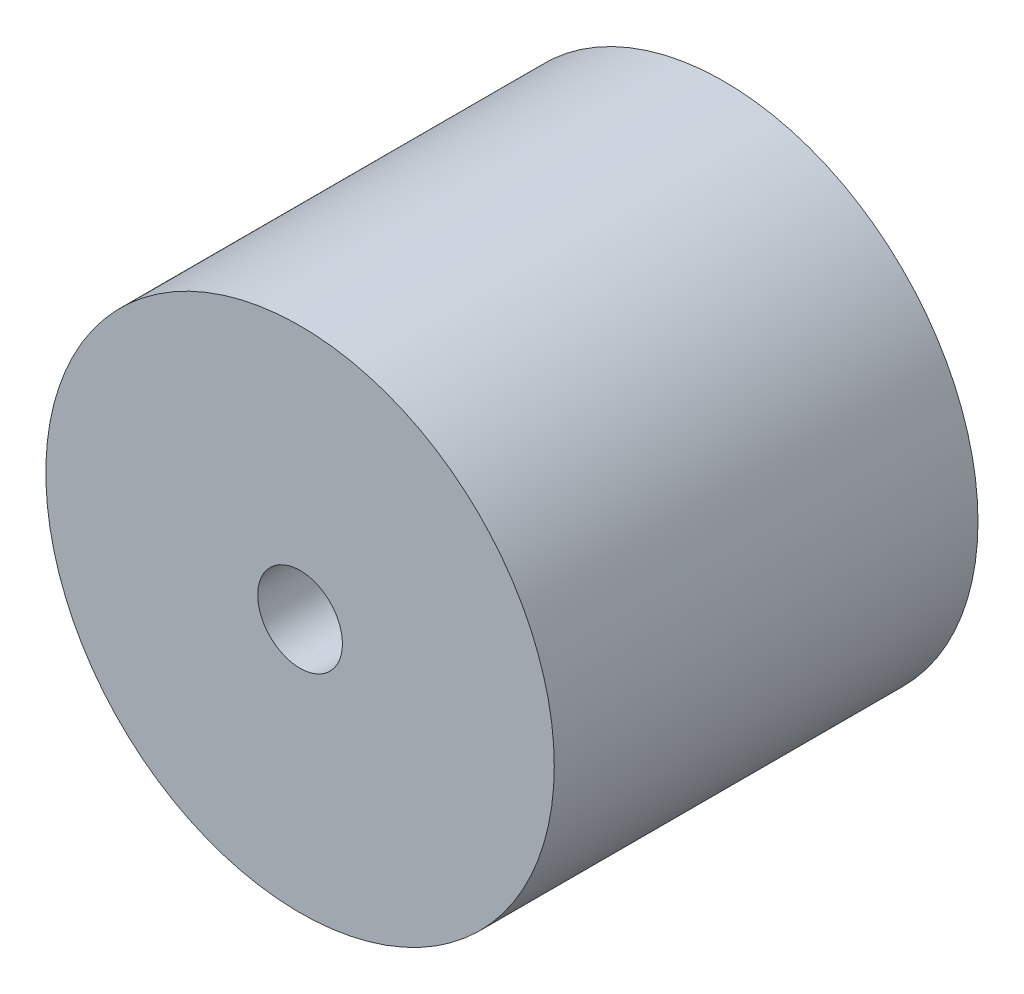
ISO-10303-21;
HEADER;
FILE_DESCRIPTION(('STEP AP214'),'2;1');
FILE_NAME('part.step','',(''),(''),'','','');
FILE_SCHEMA(('AUTOMOTIVE_DESIGN { 1 0 10303 214 1 1 1 1 }'));
ENDSEC;
DATA;
#1=APPLICATION_CONTEXT('core data for automotive mechanical design processes');
#2=APPLICATION_PROTOCOL_DEFINITION('international standard','automotive_design',2000,#1);
#3=PRODUCT_CONTEXT('',#1,'mechanical');
#4=PRODUCT('Part','Part','',(#3));
#5=PRODUCT_RELATED_PRODUCT_CATEGORY('part','',(#4));
#6=PRODUCT_DEFINITION_FORMATION('','',#4);
#7=PRODUCT_DEFINITION_CONTEXT('part definition',#1,'design');
#8=PRODUCT_DEFINITION('design','',#6,#7);
#9=PRODUCT_DEFINITION_SHAPE('','',#8);
#10=(LENGTH_UNIT() NAMED_UNIT(*) SI_UNIT(.MILLI.,.METRE.));
#11=(NAMED_UNIT(*) PLANE_ANGLE_UNIT() SI_UNIT($,.RADIAN.));
#12=(NAMED_UNIT(*) SI_UNIT($,.STERADIAN.) SOLID_ANGLE_UNIT());
#13=UNCERTAINTY_MEASURE_WITH_UNIT(LENGTH_MEASURE(1.E-05),#10,'distance_accuracy_value','');
#14=(GEOMETRIC_REPRESENTATION_CONTEXT(3) GLOBAL_UNCERTAINTY_ASSIGNED_CONTEXT((#13)) GLOBAL_UNIT_ASSIGNED_CONTEXT((#10,
#11,#12)) REPRESENTATION_CONTEXT('',''));
#15=CARTESIAN_POINT('',(0.,0.,0.));
#16=DIRECTION('',(0.,0.,1.));
#17=DIRECTION('',(1.,0.,0.));
#18=AXIS2_PLACEMENT_3D('',#15,#16,#17);
#19=CARTESIAN_POINT('',(0.,0.,15.));
#20=DIRECTION('',(0.,0.,1.));
#21=DIRECTION('',(1.,0.,0.));
#22=AXIS2_PLACEMENT_3D('',#19,#20,#21);
#23=PLANE('',#22);
#24=CARTESIAN_POINT('',(0.,0.,15.));
#25=DIRECTION('',(0.,0.,1.));
#26=DIRECTION('',(1.,0.,0.));
#27=AXIS2_PLACEMENT_3D('',#24,#25,#26);
#28=CIRCLE('',#27,18.);
#29=CARTESIAN_POINT('',(18.,0.,15.));
#30=VERTEX_POINT('',#29);
#31=EDGE_CURVE('E10',#30,#30,#28,.T.);
#32=ORIENTED_EDGE('',*,*,#31,.T.);
#33=EDGE_LOOP('',(#32));
#34=FACE_BOUND('',#33,.T.);
#35=CARTESIAN_POINT('',(0.,0.,15.));
#36=DIRECTION('',(0.,0.,1.));
#37=DIRECTION('',(1.,0.,0.));
#38=AXIS2_PLACEMENT_3D('',#35,#36,#37);
#39=CIRCLE('',#38,3.);
#40=CARTESIAN_POINT('',(3.,0.,15.));
#41=VERTEX_POINT('',#40);
#42=EDGE_CURVE('E46',#41,#41,#39,.T.);
#43=ORIENTED_EDGE('',*,*,#42,.F.);
#44=EDGE_LOOP('',(#43));
#45=FACE_BOUND('',#44,.T.);
#46=ADVANCED_FACE('F35',(#34,#45),#23,.T.);
#47=CARTESIAN_POINT('',(0.,0.,-15.));
#48=DIRECTION('',(0.,0.,1.));
#49=DIRECTION('',(1.,0.,0.));
#50=AXIS2_PLACEMENT_3D('',#47,#48,#49);
#51=PLANE('',#50);
#52=CARTESIAN_POINT('',(0.,0.,-15.));
#53=DIRECTION('',(0.,0.,1.));
#54=DIRECTION('',(1.,0.,0.));
#55=AXIS2_PLACEMENT_3D('',#52,#53,#54);
#56=CIRCLE('',#55,18.);
#57=CARTESIAN_POINT('',(18.,0.,-15.));
#58=VERTEX_POINT('',#57);
#59=EDGE_CURVE('E39',#58,#58,#56,.T.);
#60=ORIENTED_EDGE('',*,*,#59,.F.);
#61=EDGE_LOOP('',(#60));
#62=FACE_BOUND('',#61,.T.);
#63=CARTESIAN_POINT('',(0.,0.,-15.));
#64=DIRECTION('',(0.,0.,1.));
#65=DIRECTION('',(1.,0.,0.));
#66=AXIS2_PLACEMENT_3D('',#63,#64,#65);
#67=CIRCLE('',#66,3.);
#68=CARTESIAN_POINT('',(3.,0.,-15.));
#69=VERTEX_POINT('',#68);
#70=EDGE_CURVE('E48',#69,#69,#67,.T.);
#71=ORIENTED_EDGE('',*,*,#70,.T.);
#72=EDGE_LOOP('',(#71));
#73=FACE_BOUND('',#72,.T.);
#74=ADVANCED_FACE('F58',(#62,#73),#51,.F.);
#75=CARTESIAN_POINT('',(0.,0.,15.));
#76=DIRECTION('',(0.,0.,-1.));
#77=DIRECTION('',(-1.,0.,0.));
#78=AXIS2_PLACEMENT_3D('',#75,#76,#77);
#79=CYLINDRICAL_SURFACE('',#78,18.);
#80=ORIENTED_EDGE('',*,*,#31,.F.);
#81=EDGE_LOOP('',(#80));
#82=FACE_BOUND('',#81,.T.);
#83=ORIENTED_EDGE('',*,*,#59,.T.);
#84=EDGE_LOOP('',(#83));
#85=FACE_BOUND('',#84,.T.);
#86=ADVANCED_FACE('F37',(#82,#85),#79,.T.);
#87=CARTESIAN_POINT('',(0.,0.,15.));
#88=DIRECTION('',(0.,0.,-1.));
#89=DIRECTION('',(-1.,0.,0.));
#90=AXIS2_PLACEMENT_3D('',#87,#88,#89);
#91=CYLINDRICAL_SURFACE('',#90,3.);
#92=ORIENTED_EDGE('',*,*,#42,.T.);
#93=EDGE_LOOP('',(#92));
#94=FACE_BOUND('',#93,.T.);
#95=ORIENTED_EDGE('',*,*,#70,.F.);
#96=EDGE_LOOP('',(#95));
#97=FACE_BOUND('',#96,.T.);
#98=ADVANCED_FACE('F54',(#94,#97),#91,.F.);
#99=CLOSED_SHELL('',(#46,#74,#86,#98));
#100=MANIFOLD_SOLID_BREP('B2',#99);
#101=ADVANCED_BREP_SHAPE_REPRESENTATION('',(#18,#100),#14);
#102=SHAPE_DEFINITION_REPRESENTATION(#9,#101);
ENDSEC;
END-ISO-10303-21;
